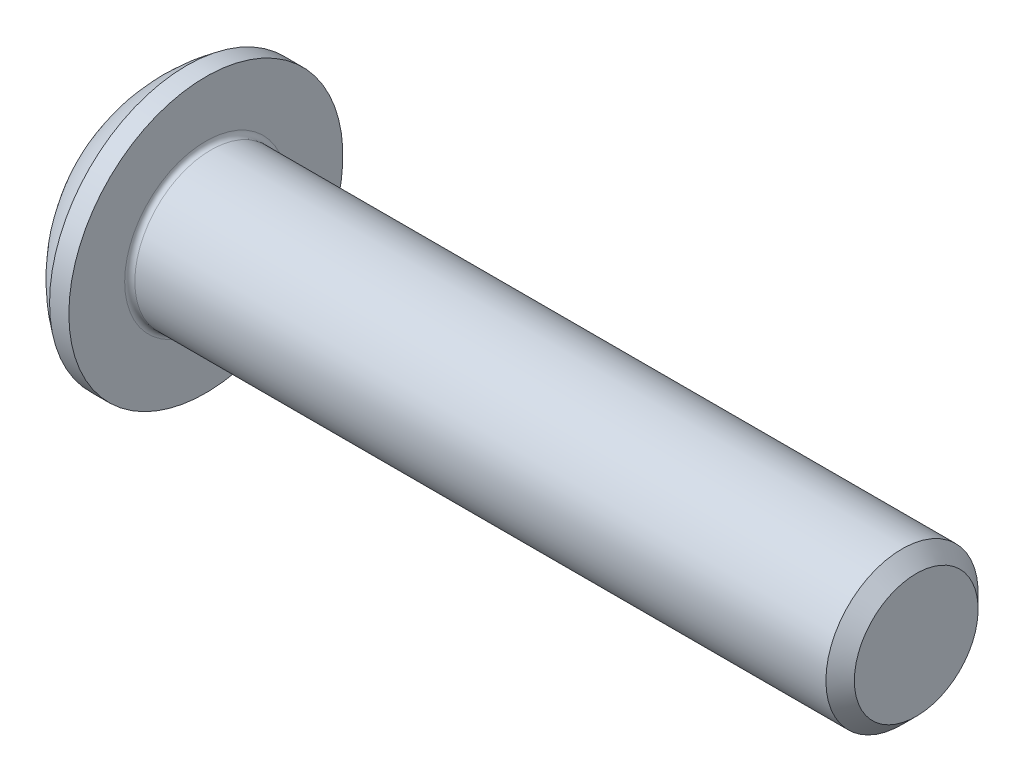
ISO-10303-21;
HEADER;
FILE_DESCRIPTION(('STEP AP214'),'2;1');
FILE_NAME('part.step','',(''),(''),'','','');
FILE_SCHEMA(('AUTOMOTIVE_DESIGN { 1 0 10303 214 1 1 1 1 }'));
ENDSEC;
DATA;
#1=APPLICATION_CONTEXT('core data for automotive mechanical design processes');
#2=APPLICATION_PROTOCOL_DEFINITION('international standard','automotive_design',2000,#1);
#3=PRODUCT_CONTEXT('',#1,'mechanical');
#4=PRODUCT('Part','Part','',(#3));
#5=PRODUCT_RELATED_PRODUCT_CATEGORY('part','',(#4));
#6=PRODUCT_DEFINITION_FORMATION('','',#4);
#7=PRODUCT_DEFINITION_CONTEXT('part definition',#1,'design');
#8=PRODUCT_DEFINITION('design','',#6,#7);
#9=PRODUCT_DEFINITION_SHAPE('','',#8);
#10=(LENGTH_UNIT() NAMED_UNIT(*) SI_UNIT(.MILLI.,.METRE.));
#11=(NAMED_UNIT(*) PLANE_ANGLE_UNIT() SI_UNIT($,.RADIAN.));
#12=(NAMED_UNIT(*) SI_UNIT($,.STERADIAN.) SOLID_ANGLE_UNIT());
#13=UNCERTAINTY_MEASURE_WITH_UNIT(LENGTH_MEASURE(1.E-05),#10,'distance_accuracy_value','');
#14=(GEOMETRIC_REPRESENTATION_CONTEXT(3) GLOBAL_UNCERTAINTY_ASSIGNED_CONTEXT((#13)) GLOBAL_UNIT_ASSIGNED_CONTEXT((#10,
#11,#12)) REPRESENTATION_CONTEXT('',''));
#15=CARTESIAN_POINT('',(0.,0.,0.));
#16=DIRECTION('',(0.,0.,1.));
#17=DIRECTION('',(1.,0.,0.));
#18=AXIS2_PLACEMENT_3D('',#15,#16,#17);
#19=CARTESIAN_POINT('',(0.,0.,0.));
#20=DIRECTION('',(-1.,0.,0.));
#21=DIRECTION('',(0.,0.,1.));
#22=AXIS2_PLACEMENT_3D('',#19,#20,#21);
#23=PLANE('',#22);
#24=CARTESIAN_POINT('',(0.,0.,0.));
#25=DIRECTION('',(-1.,0.,0.));
#26=DIRECTION('',(0.,0.,1.));
#27=AXIS2_PLACEMENT_3D('',#24,#25,#26);
#28=CIRCLE('',#27,1.35);
#29=CARTESIAN_POINT('',(0.,1.35,0.));
#30=VERTEX_POINT('',#29);
#31=EDGE_CURVE('E156',#30,#30,#28,.T.);
#32=ORIENTED_EDGE('',*,*,#31,.T.);
#33=EDGE_LOOP('',(#32));
#34=FACE_BOUND('',#33,.T.);
#35=DIRECTION('',(0.,-1.,0.));
#36=VECTOR('',#35,1.);
#37=CARTESIAN_POINT('',(0.,-0.577350269189625,0.999999999999998));
#38=LINE('',#37,#36);
#39=CARTESIAN_POINT('',(0.,0.577350269189628,1.));
#40=VERTEX_POINT('',#39);
#41=CARTESIAN_POINT('',(0.,-0.577350269189625,0.999999999999998));
#42=VERTEX_POINT('',#41);
#43=EDGE_CURVE('E51',#40,#42,#38,.T.);
#44=ORIENTED_EDGE('',*,*,#43,.T.);
#45=DIRECTION('',(0.,-0.499999999999999,-0.866025403784439));
#46=VECTOR('',#45,1.);
#47=CARTESIAN_POINT('',(0.,-1.15470053837925,0.));
#48=LINE('',#47,#46);
#49=CARTESIAN_POINT('',(0.,-1.15470053837925,0.));
#50=VERTEX_POINT('',#49);
#51=EDGE_CURVE('E276',#42,#50,#48,.T.);
#52=ORIENTED_EDGE('',*,*,#51,.T.);
#53=DIRECTION('',(0.,0.499999999999997,-0.86602540378444));
#54=VECTOR('',#53,1.);
#55=CARTESIAN_POINT('',(0.,-0.577350269189626,-1.));
#56=LINE('',#55,#54);
#57=CARTESIAN_POINT('',(0.,-0.577350269189626,-1.));
#58=VERTEX_POINT('',#57);
#59=EDGE_CURVE('E131',#50,#58,#56,.T.);
#60=ORIENTED_EDGE('',*,*,#59,.T.);
#61=DIRECTION('',(0.,1.,0.));
#62=VECTOR('',#61,1.);
#63=CARTESIAN_POINT('',(0.,0.577350269189628,-1.));
#64=LINE('',#63,#62);
#65=CARTESIAN_POINT('',(0.,0.577350269189628,-1.));
#66=VERTEX_POINT('',#65);
#67=EDGE_CURVE('E279',#58,#66,#64,.T.);
#68=ORIENTED_EDGE('',*,*,#67,.T.);
#69=DIRECTION('',(0.,0.499999999999998,0.866025403784439));
#70=VECTOR('',#69,1.);
#71=CARTESIAN_POINT('',(0.,1.15470053837925,0.));
#72=LINE('',#71,#70);
#73=CARTESIAN_POINT('',(0.,1.15470053837925,0.));
#74=VERTEX_POINT('',#73);
#75=EDGE_CURVE('E281',#66,#74,#72,.T.);
#76=ORIENTED_EDGE('',*,*,#75,.T.);
#77=DIRECTION('',(0.,-0.499999999999998,0.866025403784439));
#78=VECTOR('',#77,1.);
#79=CARTESIAN_POINT('',(0.,0.577350269189628,1.));
#80=LINE('',#79,#78);
#81=EDGE_CURVE('E283',#74,#40,#80,.T.);
#82=ORIENTED_EDGE('',*,*,#81,.T.);
#83=EDGE_LOOP('',(#44,#52,#60,#68,#76,#82));
#84=FACE_BOUND('',#83,.T.);
#85=ADVANCED_FACE('F36',(#34,#84),#23,.T.);
#86=CARTESIAN_POINT('',(3.00084821428572,0.,0.));
#87=DIRECTION('',(-1.,0.,0.));
#88=DIRECTION('',(0.,1.,0.));
#89=AXIS2_PLACEMENT_3D('',#86,#87,#88);
#90=SPHERICAL_SURFACE('',#89,3.2905303531774);
#91=CARTESIAN_POINT('',(1.12,0.,0.));
#92=DIRECTION('',(-1.,0.,0.));
#93=DIRECTION('',(0.,0.,1.));
#94=AXIS2_PLACEMENT_3D('',#91,#92,#93);
#95=CIRCLE('',#94,2.7);
#96=CARTESIAN_POINT('',(1.12,2.7,0.));
#97=VERTEX_POINT('',#96);
#98=EDGE_CURVE('E153',#97,#97,#95,.T.);
#99=CARTESIAN_POINT('',(1.12,2.7,0.));
#100=CARTESIAN_POINT('',(1.10482372077204,2.68942806470524,0.));
#101=CARTESIAN_POINT('',(1.08973659465567,2.67872814892318,0.));
#102=CARTESIAN_POINT('',(1.05974489755003,2.65707545548055,0.));
#103=CARTESIAN_POINT('',(1.04484032656076,2.64612267781998,0.));
#104=CARTESIAN_POINT('',(1.01521798861329,2.62396735971641,0.));
#105=CARTESIAN_POINT('',(1.00050022165509,2.6127648192734,0.));
#106=CARTESIAN_POINT('',(0.97125567364969,2.59011316498315,0.));
#107=CARTESIAN_POINT('',(0.956728892602496,2.5786640511359,0.));
#108=CARTESIAN_POINT('',(0.927870447721313,2.55552250436343,0.));
#109=CARTESIAN_POINT('',(0.913538783887323,2.54383007143821,0.));
#110=CARTESIAN_POINT('',(0.885074648256933,2.5202052114041,0.));
#111=CARTESIAN_POINT('',(0.870942176460533,2.50827278429522,0.));
#112=CARTESIAN_POINT('',(0.842880443359429,2.4841713286569,0.));
#113=CARTESIAN_POINT('',(0.828951182054725,2.47200230012746,0.));
#114=CARTESIAN_POINT('',(0.801299830538979,2.44743110178524,0.));
#115=CARTESIAN_POINT('',(0.787577740327935,2.43502893197244,0.));
#116=CARTESIAN_POINT('',(0.760344632714087,2.40999497746497,0.));
#117=CARTESIAN_POINT('',(0.746833615311283,2.39736319277029,0.));
#118=CARTESIAN_POINT('',(0.720026495007341,2.37187360019589,0.));
#119=CARTESIAN_POINT('',(0.706730392106203,2.35901579231616,0.));
#120=CARTESIAN_POINT('',(0.680356881392061,2.33307780933353,0.));
#121=CARTESIAN_POINT('',(0.667279473579057,2.31999763423063,0.));
#122=CARTESIAN_POINT('',(0.641347071443974,2.29361863599147,0.));
#123=CARTESIAN_POINT('',(0.628492077121894,2.28031981285522,0.));
#124=CARTESIAN_POINT('',(0.603008157130962,2.25350729990897,0.));
#125=CARTESIAN_POINT('',(0.59037923146211,2.23999361009898,0.));
#126=CARTESIAN_POINT('',(0.565351039660019,2.21275520625964,0.));
#127=CARTESIAN_POINT('',(0.55295177352678,2.1990304922303,0.));
#128=CARTESIAN_POINT('',(0.528386426377395,2.17137394240884,0.));
#129=CARTESIAN_POINT('',(0.516220345361249,2.15744210661672,0.));
#130=CARTESIAN_POINT('',(0.492124827724157,2.12937527461883,0.));
#131=CARTESIAN_POINT('',(0.480195391103212,2.11524027841307,0.));
#132=CARTESIAN_POINT('',(0.456576554247658,2.08677114470325,0.));
#133=CARTESIAN_POINT('',(0.444887154013049,2.07243700719919,0.));
#134=CARTESIAN_POINT('',(0.421751713669854,2.04357366663155,0.));
#135=CARTESIAN_POINT('',(0.410305673561269,2.02904446356797,0.));
#136=CARTESIAN_POINT('',(0.387660208013302,1.99979512308459,0.));
#137=CARTESIAN_POINT('',(0.37646078257392,1.98507498566479,0.));
#138=CARTESIAN_POINT('',(0.354311730785633,1.95544796196215,0.));
#139=CARTESIAN_POINT('',(0.343362104436729,1.94054107567931,0.));
#140=CARTESIAN_POINT('',(0.321715764223333,1.91054479284356,0.));
#141=CARTESIAN_POINT('',(0.31101905035884,1.89545539629064,0.));
#142=CARTESIAN_POINT('',(0.289881576595549,1.86509838340229,0.));
#143=CARTESIAN_POINT('',(0.279440816696752,1.84983076706686,0.));
#144=CARTESIAN_POINT('',(0.258818219568872,1.81912165577563,0.));
#145=CARTESIAN_POINT('',(0.248636382339789,1.80368016081982,0.));
#146=CARTESIAN_POINT('',(0.228534525633257,1.77262768289053,0.));
#147=CARTESIAN_POINT('',(0.218614506155807,1.75701669991704,0.));
#148=CARTESIAN_POINT('',(0.199039105591874,1.72562968474594,0.));
#149=CARTESIAN_POINT('',(0.189383724505391,1.70985365254832,0.));
#150=CARTESIAN_POINT('',(0.170340346108043,1.67814102465602,0.));
#151=CARTESIAN_POINT('',(0.160952348797177,1.66220442896133,0.));
#152=CARTESIAN_POINT('',(0.142446407338065,1.63017520544224,0.));
#153=CARTESIAN_POINT('',(0.133328463189819,1.61408257761785,0.));
#154=CARTESIAN_POINT('',(0.11536522054576,1.58174586562472,0.));
#155=CARTESIAN_POINT('',(0.106519922049946,1.56550178145597,0.));
#156=CARTESIAN_POINT('',(0.0891044860907166,1.53286677542973,0.));
#157=CARTESIAN_POINT('',(0.0805343486273016,1.51647585357223,0.));
#158=CARTESIAN_POINT('',(0.0636716703303594,1.48355183330163,0.));
#159=CARTESIAN_POINT('',(0.0553791294968322,1.46701873488853,0.));
#160=CARTESIAN_POINT('',(0.0390740068873081,1.43381506035644,0.));
#161=CARTESIAN_POINT('',(0.0310614251113112,1.41714448423745,0.));
#162=CARTESIAN_POINT('',(0.0153184819396781,1.38367060234587,0.));
#163=CARTESIAN_POINT('',(0.00758812054404176,1.36686729657327,0.));
#164=CARTESIAN_POINT('',(0.,1.35,0.));
#165=B_SPLINE_CURVE_WITH_KNOTS('',3,(#99,#100,#101,#102,#103,#104,#105,#106,#107,#108,#109,#110,
#111,#112,#113,#114,#115,#116,#117,#118,#119,#120,#121,#122,#123,#124,#125,#126,#127,#128,#129,
#130,#131,#132,#133,#134,#135,#136,#137,#138,#139,#140,#141,#142,#143,#144,#145,#146,#147,#148,
#149,#150,#151,#152,#153,#154,#155,#156,#157,#158,#159,#160,#161,#162,#163,#164),.UNSPECIFIED.,
.F.,.F.,(4,2,2,2,2,2,2,2,2,2,2,2,2,2,2,2,2,2,2,2,2,2,2,2,2,2,2,2,2,2,2,2,4),(0.,
0.0554859835022788,0.110971967004558,0.166457950506837,0.221943934009115,0.277429917511395,
0.332915901013674,0.388401884515953,0.443887868018232,0.499373851520511,0.55485983502279,
0.610345818525069,0.665831802027348,0.721317785529627,0.776803769031906,0.832289752534185,
0.887775736036464,0.943261719538742,0.998747703041022,1.0542336865433,1.10971967004558,
1.16520565354786,1.22069163705014,1.27617762055242,1.3316636040547,1.38714958755697,
1.44263557105925,1.49812155456153,1.55360753806381,1.60909352156609,1.66457950506837,
1.72006548857065,1.77555147207293),.UNSPECIFIED.);
#166=EDGE_CURVE('BSEAM177',#97,#30,#165,.T.);
#167=ORIENTED_EDGE('',*,*,#98,.T.);
#168=ORIENTED_EDGE('',*,*,#31,.F.);
#169=ORIENTED_EDGE('',*,*,#166,.T.);
#170=ORIENTED_EDGE('',*,*,#166,.F.);
#171=EDGE_LOOP('',(#167,#169,#168,#170));
#172=FACE_BOUND('',#171,.T.);
#173=ADVANCED_FACE('F177',(#172),#90,.T.);
#174=CARTESIAN_POINT('',(0.,0.,0.));
#175=DIRECTION('',(-1.,0.,0.));
#176=DIRECTION('',(0.,0.,1.));
#177=AXIS2_PLACEMENT_3D('',#174,#175,#176);
#178=CYLINDRICAL_SURFACE('',#177,2.7);
#179=ORIENTED_EDGE('',*,*,#98,.F.);
#180=EDGE_LOOP('',(#179));
#181=FACE_BOUND('',#180,.T.);
#182=CARTESIAN_POINT('',(1.5,0.,0.));
#183=DIRECTION('',(-1.,0.,0.));
#184=DIRECTION('',(0.,0.,1.));
#185=AXIS2_PLACEMENT_3D('',#182,#183,#184);
#186=CIRCLE('',#185,2.7);
#187=CARTESIAN_POINT('',(1.5,0.,2.7));
#188=VERTEX_POINT('',#187);
#189=EDGE_CURVE('E150',#188,#188,#186,.T.);
#190=ORIENTED_EDGE('',*,*,#189,.T.);
#191=EDGE_LOOP('',(#190));
#192=FACE_BOUND('',#191,.T.);
#193=ADVANCED_FACE('F182',(#181,#192),#178,.T.);
#194=CARTESIAN_POINT('',(1.5,1.5,0.));
#195=DIRECTION('',(-1.,0.,0.));
#196=DIRECTION('',(0.,0.,1.));
#197=AXIS2_PLACEMENT_3D('',#194,#195,#196);
#198=PLANE('',#197);
#199=CARTESIAN_POINT('',(1.5,0.,0.));
#200=DIRECTION('',(-1.,0.,0.));
#201=DIRECTION('',(0.,0.,1.));
#202=AXIS2_PLACEMENT_3D('',#199,#200,#201);
#203=CIRCLE('',#202,1.6);
#204=CARTESIAN_POINT('',(1.5,0.,1.6));
#205=VERTEX_POINT('',#204);
#206=EDGE_CURVE('E44',#205,#205,#203,.T.);
#207=ORIENTED_EDGE('',*,*,#206,.T.);
#208=EDGE_LOOP('',(#207));
#209=FACE_BOUND('',#208,.T.);
#210=ORIENTED_EDGE('',*,*,#189,.F.);
#211=EDGE_LOOP('',(#210));
#212=FACE_BOUND('',#211,.T.);
#213=ADVANCED_FACE('F161',(#209,#212),#198,.F.);
#214=CARTESIAN_POINT('',(0.,0.,0.));
#215=DIRECTION('',(-1.,0.,0.));
#216=DIRECTION('',(0.,0.,1.));
#217=AXIS2_PLACEMENT_3D('',#214,#215,#216);
#218=CYLINDRICAL_SURFACE('',#217,1.5);
#219=CARTESIAN_POINT('',(1.6,0.,0.));
#220=DIRECTION('',(-1.,0.,0.));
#221=DIRECTION('',(0.,0.,1.));
#222=AXIS2_PLACEMENT_3D('',#219,#220,#221);
#223=CIRCLE('',#222,1.5);
#224=CARTESIAN_POINT('',(1.6,0.,1.5));
#225=VERTEX_POINT('',#224);
#226=EDGE_CURVE('E11',#225,#225,#223,.F.);
#227=ORIENTED_EDGE('',*,*,#226,.T.);
#228=EDGE_LOOP('',(#227));
#229=FACE_BOUND('',#228,.T.);
#230=CARTESIAN_POINT('',(15.2195,0.,0.));
#231=DIRECTION('',(-1.,0.,0.));
#232=DIRECTION('',(0.,0.,1.));
#233=AXIS2_PLACEMENT_3D('',#230,#231,#232);
#234=CIRCLE('',#233,1.5);
#235=CARTESIAN_POINT('',(15.2195,0.,1.5));
#236=VERTEX_POINT('',#235);
#237=EDGE_CURVE('E147',#236,#236,#234,.T.);
#238=ORIENTED_EDGE('',*,*,#237,.T.);
#239=EDGE_LOOP('',(#238));
#240=FACE_BOUND('',#239,.T.);
#241=ADVANCED_FACE('F191',(#229,#240),#218,.T.);
#242=CARTESIAN_POINT('',(15.5,0.,0.));
#243=DIRECTION('',(-1.,0.,0.));
#244=DIRECTION('',(0.,0.,1.));
#245=AXIS2_PLACEMENT_3D('',#242,#243,#244);
#246=CONICAL_SURFACE('',#245,1.2195,0.785398163397434);
#247=ORIENTED_EDGE('',*,*,#237,.F.);
#248=EDGE_LOOP('',(#247));
#249=FACE_BOUND('',#248,.T.);
#250=CARTESIAN_POINT('',(15.5,0.,0.));
#251=DIRECTION('',(-1.,0.,0.));
#252=DIRECTION('',(0.,0.,1.));
#253=AXIS2_PLACEMENT_3D('',#250,#251,#252);
#254=CIRCLE('',#253,1.2195);
#255=CARTESIAN_POINT('',(15.5,0.,1.2195));
#256=VERTEX_POINT('',#255);
#257=EDGE_CURVE('E143',#256,#256,#254,.T.);
#258=ORIENTED_EDGE('',*,*,#257,.T.);
#259=EDGE_LOOP('',(#258));
#260=FACE_BOUND('',#259,.T.);
#261=ADVANCED_FACE('F172',(#249,#260),#246,.T.);
#262=CARTESIAN_POINT('',(15.5,0.,0.));
#263=DIRECTION('',(-1.,0.,0.));
#264=DIRECTION('',(0.,0.,1.));
#265=AXIS2_PLACEMENT_3D('',#262,#263,#264);
#266=PLANE('',#265);
#267=ORIENTED_EDGE('',*,*,#257,.F.);
#268=EDGE_LOOP('',(#267));
#269=FACE_BOUND('',#268,.T.);
#270=ADVANCED_FACE('F165',(#269),#266,.F.);
#271=CARTESIAN_POINT('',(1.6,0.,0.));
#272=DIRECTION('',(-1.,0.,0.));
#273=DIRECTION('',(0.,0.,1.));
#274=AXIS2_PLACEMENT_3D('',#271,#272,#273);
#275=TOROIDAL_SURFACE('',#274,1.6,0.1);
#276=ORIENTED_EDGE('',*,*,#226,.F.);
#277=EDGE_LOOP('',(#276));
#278=FACE_BOUND('',#277,.T.);
#279=ORIENTED_EDGE('',*,*,#206,.F.);
#280=EDGE_LOOP('',(#279));
#281=FACE_BOUND('',#280,.T.);
#282=ADVANCED_FACE('F38',(#278,#281),#275,.F.);
#283=CARTESIAN_POINT('',(1.04,-1.15470053837925,0.));
#284=DIRECTION('',(0.,0.866025403784439,-0.499999999999999));
#285=DIRECTION('',(0.,0.499999999999999,0.866025403784439));
#286=AXIS2_PLACEMENT_3D('',#283,#284,#285);
#287=PLANE('',#286);
#288=DIRECTION('',(0.,-0.499999999999999,-0.866025403784439));
#289=VECTOR('',#288,1.);
#290=CARTESIAN_POINT('',(1.04,-1.15470053837925,0.));
#291=LINE('',#290,#289);
#292=CARTESIAN_POINT('',(1.04,-0.577350269189625,0.999999999999998));
#293=VERTEX_POINT('',#292);
#294=CARTESIAN_POINT('',(1.04,-0.866025403784437,0.499999999999998));
#295=VERTEX_POINT('',#294);
#296=EDGE_CURVE('E117',#293,#295,#291,.T.);
#297=ORIENTED_EDGE('',*,*,#296,.T.);
#298=CARTESIAN_POINT('',(1.04,-1.15470053837925,0.));
#299=VERTEX_POINT('',#298);
#300=EDGE_CURVE('E112',#295,#299,#291,.T.);
#301=ORIENTED_EDGE('',*,*,#300,.T.);
#302=DIRECTION('',(-1.,0.,0.));
#303=VECTOR('',#302,1.);
#304=CARTESIAN_POINT('',(1.04,-1.15470053837925,0.));
#305=LINE('',#304,#303);
#306=EDGE_CURVE('E114',#299,#50,#305,.T.);
#307=ORIENTED_EDGE('',*,*,#306,.T.);
#308=ORIENTED_EDGE('',*,*,#51,.F.);
#309=DIRECTION('',(-1.,0.,0.));
#310=VECTOR('',#309,1.);
#311=CARTESIAN_POINT('',(1.04,-0.577350269189625,0.999999999999998));
#312=LINE('',#311,#310);
#313=EDGE_CURVE('E272',#293,#42,#312,.T.);
#314=ORIENTED_EDGE('',*,*,#313,.F.);
#315=EDGE_LOOP('',(#297,#301,#307,#308,#314));
#316=FACE_BOUND('',#315,.T.);
#317=ADVANCED_FACE('F113',(#316),#287,.T.);
#318=CARTESIAN_POINT('',(1.04,-0.577350269189626,-1.));
#319=DIRECTION('',(0.,0.86602540378444,0.499999999999998));
#320=DIRECTION('',(0.,-0.499999999999998,0.86602540378444));
#321=AXIS2_PLACEMENT_3D('',#318,#319,#320);
#322=PLANE('',#321);
#323=DIRECTION('',(0.,0.499999999999997,-0.86602540378444));
#324=VECTOR('',#323,1.);
#325=CARTESIAN_POINT('',(1.04,-0.577350269189626,-1.));
#326=LINE('',#325,#324);
#327=CARTESIAN_POINT('',(1.04,-0.86602540378444,-0.499999999999997));
#328=VERTEX_POINT('',#327);
#329=EDGE_CURVE('E59',#299,#328,#326,.T.);
#330=ORIENTED_EDGE('',*,*,#329,.T.);
#331=CARTESIAN_POINT('',(1.04,-0.577350269189626,-1.));
#332=VERTEX_POINT('',#331);
#333=EDGE_CURVE('E126',#328,#332,#326,.T.);
#334=ORIENTED_EDGE('',*,*,#333,.T.);
#335=DIRECTION('',(-1.,0.,0.));
#336=VECTOR('',#335,1.);
#337=CARTESIAN_POINT('',(1.04,-0.577350269189626,-1.));
#338=LINE('',#337,#336);
#339=EDGE_CURVE('E133',#332,#58,#338,.T.);
#340=ORIENTED_EDGE('',*,*,#339,.T.);
#341=ORIENTED_EDGE('',*,*,#59,.F.);
#342=ORIENTED_EDGE('',*,*,#306,.F.);
#343=EDGE_LOOP('',(#330,#334,#340,#341,#342));
#344=FACE_BOUND('',#343,.T.);
#345=ADVANCED_FACE('F129',(#344),#322,.T.);
#346=CARTESIAN_POINT('',(1.04,0.577350269189628,-1.));
#347=DIRECTION('',(0.,0.,1.));
#348=DIRECTION('',(0.,-1.,0.));
#349=AXIS2_PLACEMENT_3D('',#346,#347,#348);
#350=PLANE('',#349);
#351=DIRECTION('',(0.,1.,0.));
#352=VECTOR('',#351,1.);
#353=CARTESIAN_POINT('',(1.04,0.577350269189628,-1.));
#354=LINE('',#353,#352);
#355=CARTESIAN_POINT('',(1.04,0.,-1.));
#356=VERTEX_POINT('',#355);
#357=EDGE_CURVE('E253',#332,#356,#354,.T.);
#358=ORIENTED_EDGE('',*,*,#357,.T.);
#359=CARTESIAN_POINT('',(1.04,0.577350269189628,-1.));
#360=VERTEX_POINT('',#359);
#361=EDGE_CURVE('E125',#356,#360,#354,.T.);
#362=ORIENTED_EDGE('',*,*,#361,.T.);
#363=DIRECTION('',(-1.,0.,0.));
#364=VECTOR('',#363,1.);
#365=CARTESIAN_POINT('',(1.04,0.577350269189628,-1.));
#366=LINE('',#365,#364);
#367=EDGE_CURVE('E138',#360,#66,#366,.T.);
#368=ORIENTED_EDGE('',*,*,#367,.T.);
#369=ORIENTED_EDGE('',*,*,#67,.F.);
#370=ORIENTED_EDGE('',*,*,#339,.F.);
#371=EDGE_LOOP('',(#358,#362,#368,#369,#370));
#372=FACE_BOUND('',#371,.T.);
#373=ADVANCED_FACE('F205',(#372),#350,.T.);
#374=CARTESIAN_POINT('',(1.04,1.15470053837925,0.));
#375=DIRECTION('',(0.,-0.86602540378444,0.499999999999998));
#376=DIRECTION('',(0.,-0.499999999999998,-0.86602540378444));
#377=AXIS2_PLACEMENT_3D('',#374,#375,#376);
#378=PLANE('',#377);
#379=DIRECTION('',(0.,0.499999999999998,0.866025403784439));
#380=VECTOR('',#379,1.);
#381=CARTESIAN_POINT('',(1.04,1.15470053837925,0.));
#382=LINE('',#381,#380);
#383=CARTESIAN_POINT('',(1.04,0.86602540378444,-0.499999999999999));
#384=VERTEX_POINT('',#383);
#385=EDGE_CURVE('E242',#360,#384,#382,.T.);
#386=ORIENTED_EDGE('',*,*,#385,.T.);
#387=CARTESIAN_POINT('',(1.04,1.15470053837925,0.));
#388=VERTEX_POINT('',#387);
#389=EDGE_CURVE('E247',#384,#388,#382,.T.);
#390=ORIENTED_EDGE('',*,*,#389,.T.);
#391=DIRECTION('',(-1.,0.,0.));
#392=VECTOR('',#391,1.);
#393=CARTESIAN_POINT('',(1.04,1.15470053837925,0.));
#394=LINE('',#393,#392);
#395=EDGE_CURVE('E287',#388,#74,#394,.T.);
#396=ORIENTED_EDGE('',*,*,#395,.T.);
#397=ORIENTED_EDGE('',*,*,#75,.F.);
#398=ORIENTED_EDGE('',*,*,#367,.F.);
#399=EDGE_LOOP('',(#386,#390,#396,#397,#398));
#400=FACE_BOUND('',#399,.T.);
#401=ADVANCED_FACE('F208',(#400),#378,.T.);
#402=CARTESIAN_POINT('',(1.04,0.577350269189628,1.));
#403=DIRECTION('',(0.,-0.86602540378444,-0.499999999999998));
#404=DIRECTION('',(0.,0.499999999999998,-0.86602540378444));
#405=AXIS2_PLACEMENT_3D('',#402,#403,#404);
#406=PLANE('',#405);
#407=DIRECTION('',(0.,-0.499999999999998,0.866025403784439));
#408=VECTOR('',#407,1.);
#409=CARTESIAN_POINT('',(1.04,0.577350269189628,1.));
#410=LINE('',#409,#408);
#411=CARTESIAN_POINT('',(1.04,0.86602540378444,0.499999999999999));
#412=VERTEX_POINT('',#411);
#413=EDGE_CURVE('E250',#388,#412,#410,.T.);
#414=ORIENTED_EDGE('',*,*,#413,.T.);
#415=CARTESIAN_POINT('',(1.04,0.577350269189628,1.));
#416=VERTEX_POINT('',#415);
#417=EDGE_CURVE('E258',#412,#416,#410,.T.);
#418=ORIENTED_EDGE('',*,*,#417,.T.);
#419=DIRECTION('',(-1.,0.,0.));
#420=VECTOR('',#419,1.);
#421=CARTESIAN_POINT('',(1.04,0.577350269189628,1.));
#422=LINE('',#421,#420);
#423=EDGE_CURVE('E271',#416,#40,#422,.T.);
#424=ORIENTED_EDGE('',*,*,#423,.T.);
#425=ORIENTED_EDGE('',*,*,#81,.F.);
#426=ORIENTED_EDGE('',*,*,#395,.F.);
#427=EDGE_LOOP('',(#414,#418,#424,#425,#426));
#428=FACE_BOUND('',#427,.T.);
#429=ADVANCED_FACE('F212',(#428),#406,.T.);
#430=CARTESIAN_POINT('',(1.04,-0.577350269189625,0.999999999999998));
#431=DIRECTION('',(0.,0.,-1.));
#432=DIRECTION('',(0.,1.,0.));
#433=AXIS2_PLACEMENT_3D('',#430,#431,#432);
#434=PLANE('',#433);
#435=DIRECTION('',(0.,-1.,0.));
#436=VECTOR('',#435,1.);
#437=CARTESIAN_POINT('',(1.04,-0.577350269189625,0.999999999999998));
#438=LINE('',#437,#436);
#439=CARTESIAN_POINT('',(1.04,0.,1.));
#440=VERTEX_POINT('',#439);
#441=EDGE_CURVE('E264',#416,#440,#438,.T.);
#442=ORIENTED_EDGE('',*,*,#441,.T.);
#443=EDGE_CURVE('E266',#440,#293,#438,.T.);
#444=ORIENTED_EDGE('',*,*,#443,.T.);
#445=ORIENTED_EDGE('',*,*,#313,.T.);
#446=ORIENTED_EDGE('',*,*,#43,.F.);
#447=ORIENTED_EDGE('',*,*,#423,.F.);
#448=EDGE_LOOP('',(#442,#444,#445,#446,#447));
#449=FACE_BOUND('',#448,.T.);
#450=ADVANCED_FACE('F216',(#449),#434,.T.);
#451=CARTESIAN_POINT('',(1.04,-1.73205080756887,-0.999999999999999));
#452=DIRECTION('',(1.,0.,0.));
#453=DIRECTION('',(0.,0.,-1.));
#454=AXIS2_PLACEMENT_3D('',#451,#452,#453);
#455=PLANE('',#454);
#456=CARTESIAN_POINT('',(1.04,0.,0.));
#457=DIRECTION('',(-1.,0.,0.));
#458=DIRECTION('',(0.,0.,1.));
#459=AXIS2_PLACEMENT_3D('',#456,#457,#458);
#460=CIRCLE('',#459,1.);
#461=EDGE_CURVE('E239',#384,#356,#460,.T.);
#462=ORIENTED_EDGE('',*,*,#461,.F.);
#463=ORIENTED_EDGE('',*,*,#385,.F.);
#464=ORIENTED_EDGE('',*,*,#361,.F.);
#465=EDGE_LOOP('',(#462,#463,#464));
#466=FACE_BOUND('',#465,.T.);
#467=ADVANCED_FACE('F220',(#466),#455,.F.);
#468=EDGE_CURVE('E144',#412,#384,#460,.T.);
#469=ORIENTED_EDGE('',*,*,#468,.F.);
#470=ORIENTED_EDGE('',*,*,#413,.F.);
#471=ORIENTED_EDGE('',*,*,#389,.F.);
#472=EDGE_LOOP('',(#469,#470,#471));
#473=FACE_BOUND('',#472,.T.);
#474=ADVANCED_FACE('F229',(#473),#455,.F.);
#475=EDGE_CURVE('E137',#440,#412,#460,.T.);
#476=ORIENTED_EDGE('',*,*,#475,.F.);
#477=ORIENTED_EDGE('',*,*,#441,.F.);
#478=ORIENTED_EDGE('',*,*,#417,.F.);
#479=EDGE_LOOP('',(#476,#477,#478));
#480=FACE_BOUND('',#479,.T.);
#481=ADVANCED_FACE('F234',(#480),#455,.F.);
#482=EDGE_CURVE('E132',#295,#440,#460,.T.);
#483=ORIENTED_EDGE('',*,*,#482,.F.);
#484=ORIENTED_EDGE('',*,*,#296,.F.);
#485=ORIENTED_EDGE('',*,*,#443,.F.);
#486=EDGE_LOOP('',(#483,#484,#485));
#487=FACE_BOUND('',#486,.T.);
#488=ADVANCED_FACE('F227',(#487),#455,.F.);
#489=EDGE_CURVE('E123',#328,#295,#460,.T.);
#490=ORIENTED_EDGE('',*,*,#489,.F.);
#491=ORIENTED_EDGE('',*,*,#329,.F.);
#492=ORIENTED_EDGE('',*,*,#300,.F.);
#493=EDGE_LOOP('',(#490,#491,#492));
#494=FACE_BOUND('',#493,.T.);
#495=ADVANCED_FACE('F122',(#494),#455,.F.);
#496=EDGE_CURVE('E245',#356,#328,#460,.T.);
#497=ORIENTED_EDGE('',*,*,#496,.F.);
#498=ORIENTED_EDGE('',*,*,#357,.F.);
#499=ORIENTED_EDGE('',*,*,#333,.F.);
#500=EDGE_LOOP('',(#497,#498,#499));
#501=FACE_BOUND('',#500,.T.);
#502=ADVANCED_FACE('F200',(#501),#455,.F.);
#503=CARTESIAN_POINT('',(1.61735026918963,0.,0.));
#504=DIRECTION('',(-1.,0.,0.));
#505=DIRECTION('',(0.,0.,1.));
#506=AXIS2_PLACEMENT_3D('',#503,#504,#505);
#507=CONICAL_SURFACE('',#506,0.,1.04719755119659);
#508=ORIENTED_EDGE('',*,*,#475,.T.);
#509=ORIENTED_EDGE('',*,*,#468,.T.);
#510=ORIENTED_EDGE('',*,*,#461,.T.);
#511=ORIENTED_EDGE('',*,*,#496,.T.);
#512=ORIENTED_EDGE('',*,*,#489,.T.);
#513=ORIENTED_EDGE('',*,*,#482,.T.);
#514=EDGE_LOOP('',(#508,#509,#510,#511,#512,#513));
#515=FACE_BOUND('',#514,.T.);
#516=CARTESIAN_POINT('',(1.61735026918963,0.,0.));
#517=VERTEX_POINT('',#516);
#518=VERTEX_LOOP('',#517);
#519=FACE_BOUND('',#518,.T.);
#520=ADVANCED_FACE('F198',(#515,#519),#507,.F.);
#521=CLOSED_SHELL('',(#85,#173,#193,#213,#241,#261,#270,#282,#317,#345,#373,#401,#429,#450,#467,
#474,#481,#488,#495,#502,#520));
#522=MANIFOLD_SOLID_BREP('B2',#521);
#523=ADVANCED_BREP_SHAPE_REPRESENTATION('',(#18,#522),#14);
#524=SHAPE_DEFINITION_REPRESENTATION(#9,#523);
ENDSEC;
END-ISO-10303-21;
